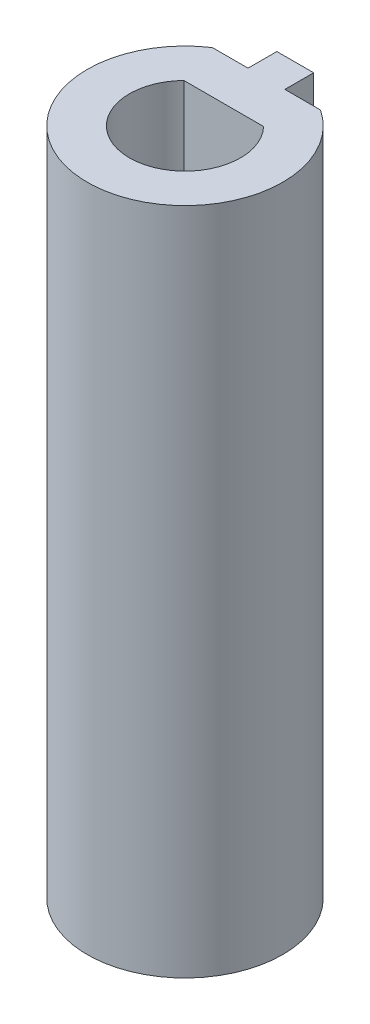
ISO-10303-21;
HEADER;
FILE_DESCRIPTION(('STEP AP214'),'2;1');
FILE_NAME('part.step','',(''),(''),'','','');
FILE_SCHEMA(('AUTOMOTIVE_DESIGN { 1 0 10303 214 1 1 1 1 }'));
ENDSEC;
DATA;
#1=APPLICATION_CONTEXT('core data for automotive mechanical design processes');
#2=APPLICATION_PROTOCOL_DEFINITION('international standard','automotive_design',2000,#1);
#3=PRODUCT_CONTEXT('',#1,'mechanical');
#4=PRODUCT('Part','Part','',(#3));
#5=PRODUCT_RELATED_PRODUCT_CATEGORY('part','',(#4));
#6=PRODUCT_DEFINITION_FORMATION('','',#4);
#7=PRODUCT_DEFINITION_CONTEXT('part definition',#1,'design');
#8=PRODUCT_DEFINITION('design','',#6,#7);
#9=PRODUCT_DEFINITION_SHAPE('','',#8);
#10=(LENGTH_UNIT() NAMED_UNIT(*) SI_UNIT(.MILLI.,.METRE.));
#11=(NAMED_UNIT(*) PLANE_ANGLE_UNIT() SI_UNIT($,.RADIAN.));
#12=(NAMED_UNIT(*) SI_UNIT($,.STERADIAN.) SOLID_ANGLE_UNIT());
#13=UNCERTAINTY_MEASURE_WITH_UNIT(LENGTH_MEASURE(1.E-05),#10,'distance_accuracy_value','');
#14=(GEOMETRIC_REPRESENTATION_CONTEXT(3) GLOBAL_UNCERTAINTY_ASSIGNED_CONTEXT((#13)) GLOBAL_UNIT_ASSIGNED_CONTEXT((#10,
#11,#12)) REPRESENTATION_CONTEXT('',''));
#15=CARTESIAN_POINT('',(0.,0.,0.));
#16=DIRECTION('',(0.,0.,1.));
#17=DIRECTION('',(1.,0.,0.));
#18=AXIS2_PLACEMENT_3D('',#15,#16,#17);
#19=CARTESIAN_POINT('',(0.,19.5,0.));
#20=DIRECTION('',(0.,-1.,0.));
#21=DIRECTION('',(0.,0.,-1.));
#22=AXIS2_PLACEMENT_3D('',#19,#20,#21);
#23=CYLINDRICAL_SURFACE('',#22,1.62);
#24=CARTESIAN_POINT('',(0.,0.,0.));
#25=DIRECTION('',(0.,1.,0.));
#26=DIRECTION('',(0.,0.,1.));
#27=AXIS2_PLACEMENT_3D('',#24,#25,#26);
#28=CIRCLE('',#27,1.62);
#29=CARTESIAN_POINT('',(-1.1623582536093,0.,-1.12841627525765));
#30=VERTEX_POINT('',#29);
#31=CARTESIAN_POINT('',(1.1623582536093,0.,-1.12841627525765));
#32=VERTEX_POINT('',#31);
#33=EDGE_CURVE('E152',#30,#32,#28,.T.);
#34=ORIENTED_EDGE('',*,*,#33,.F.);
#35=DIRECTION('',(0.,-1.,0.));
#36=VECTOR('',#35,1.);
#37=CARTESIAN_POINT('',(-1.1623582536093,19.5,-1.12841627525765));
#38=LINE('',#37,#36);
#39=CARTESIAN_POINT('',(-1.1623582536093,19.5,-1.12841627525765));
#40=VERTEX_POINT('',#39);
#41=EDGE_CURVE('E11',#40,#30,#38,.T.);
#42=ORIENTED_EDGE('',*,*,#41,.F.);
#43=CARTESIAN_POINT('',(0.,19.5,0.));
#44=DIRECTION('',(0.,1.,0.));
#45=DIRECTION('',(0.,0.,1.));
#46=AXIS2_PLACEMENT_3D('',#43,#44,#45);
#47=CIRCLE('',#46,1.62);
#48=CARTESIAN_POINT('',(1.1623582536093,19.5,-1.12841627525765));
#49=VERTEX_POINT('',#48);
#50=EDGE_CURVE('E133',#40,#49,#47,.T.);
#51=ORIENTED_EDGE('',*,*,#50,.T.);
#52=DIRECTION('',(0.,-1.,0.));
#53=VECTOR('',#52,1.);
#54=CARTESIAN_POINT('',(1.1623582536093,19.5,-1.12841627525765));
#55=LINE('',#54,#53);
#56=EDGE_CURVE('E51',#49,#32,#55,.T.);
#57=ORIENTED_EDGE('',*,*,#56,.T.);
#58=EDGE_LOOP('',(#34,#42,#51,#57));
#59=FACE_BOUND('',#58,.T.);
#60=ADVANCED_FACE('F41',(#59),#23,.F.);
#61=CARTESIAN_POINT('',(0.,19.5,-3.21507700057572));
#62=DIRECTION('',(0.,0.,-1.));
#63=DIRECTION('',(-1.,0.,0.));
#64=AXIS2_PLACEMENT_3D('',#61,#62,#63);
#65=PLANE('',#64);
#66=DIRECTION('',(1.,0.,0.));
#67=VECTOR('',#66,1.);
#68=CARTESIAN_POINT('',(0.,0.,-3.21507700057572));
#69=LINE('',#68,#67);
#70=CARTESIAN_POINT('',(-0.536355180766037,0.,-3.21507700057572));
#71=VERTEX_POINT('',#70);
#72=CARTESIAN_POINT('',(0.536355180766037,0.,-3.21507700057572));
#73=VERTEX_POINT('',#72);
#74=EDGE_CURVE('E142',#71,#73,#69,.T.);
#75=ORIENTED_EDGE('',*,*,#74,.F.);
#76=DIRECTION('',(0.,-1.,0.));
#77=VECTOR('',#76,1.);
#78=CARTESIAN_POINT('',(-0.536355180766037,19.5,-3.21507700057572));
#79=LINE('',#78,#77);
#80=CARTESIAN_POINT('',(-0.536355180766037,19.5,-3.21507700057572));
#81=VERTEX_POINT('',#80);
#82=EDGE_CURVE('E45',#81,#71,#79,.T.);
#83=ORIENTED_EDGE('',*,*,#82,.F.);
#84=DIRECTION('',(1.,0.,0.));
#85=VECTOR('',#84,1.);
#86=CARTESIAN_POINT('',(0.,19.5,-3.21507700057572));
#87=LINE('',#86,#85);
#88=CARTESIAN_POINT('',(0.536355180766037,19.5,-3.21507700057572));
#89=VERTEX_POINT('',#88);
#90=EDGE_CURVE('E124',#81,#89,#87,.T.);
#91=ORIENTED_EDGE('',*,*,#90,.T.);
#92=DIRECTION('',(0.,-1.,0.));
#93=VECTOR('',#92,1.);
#94=CARTESIAN_POINT('',(0.536355180766037,19.5,-3.21507700057572));
#95=LINE('',#94,#93);
#96=EDGE_CURVE('E114',#89,#73,#95,.T.);
#97=ORIENTED_EDGE('',*,*,#96,.T.);
#98=EDGE_LOOP('',(#75,#83,#91,#97));
#99=FACE_BOUND('',#98,.T.);
#100=ADVANCED_FACE('F43',(#99),#65,.T.);
#101=CARTESIAN_POINT('',(-0.536355180766036,19.5,0.));
#102=DIRECTION('',(1.,0.,0.));
#103=DIRECTION('',(0.,0.,-1.));
#104=AXIS2_PLACEMENT_3D('',#101,#102,#103);
#105=PLANE('',#104);
#106=DIRECTION('',(0.,0.,1.));
#107=VECTOR('',#106,1.);
#108=CARTESIAN_POINT('',(-0.536355180766036,0.,0.));
#109=LINE('',#108,#107);
#110=CARTESIAN_POINT('',(-0.536355180766037,0.,-2.375));
#111=VERTEX_POINT('',#110);
#112=EDGE_CURVE('E144',#71,#111,#109,.T.);
#113=ORIENTED_EDGE('',*,*,#112,.T.);
#114=DIRECTION('',(0.,-1.,0.));
#115=VECTOR('',#114,1.);
#116=CARTESIAN_POINT('',(-0.536355180766037,19.5,-2.375));
#117=LINE('',#116,#115);
#118=CARTESIAN_POINT('',(-0.536355180766037,19.5,-2.375));
#119=VERTEX_POINT('',#118);
#120=EDGE_CURVE('E163',#119,#111,#117,.T.);
#121=ORIENTED_EDGE('',*,*,#120,.F.);
#122=DIRECTION('',(0.,0.,1.));
#123=VECTOR('',#122,1.);
#124=CARTESIAN_POINT('',(-0.536355180766036,19.5,0.));
#125=LINE('',#124,#123);
#126=EDGE_CURVE('E126',#81,#119,#125,.T.);
#127=ORIENTED_EDGE('',*,*,#126,.F.);
#128=ORIENTED_EDGE('',*,*,#82,.T.);
#129=EDGE_LOOP('',(#113,#121,#127,#128));
#130=FACE_BOUND('',#129,.T.);
#131=ADVANCED_FACE('F171',(#130),#105,.F.);
#132=CARTESIAN_POINT('',(0.,19.5,-2.375));
#133=DIRECTION('',(0.,0.,1.));
#134=DIRECTION('',(1.,0.,0.));
#135=AXIS2_PLACEMENT_3D('',#132,#133,#134);
#136=PLANE('',#135);
#137=DIRECTION('',(-1.,0.,0.));
#138=VECTOR('',#137,1.);
#139=CARTESIAN_POINT('',(0.,0.,-2.375));
#140=LINE('',#139,#138);
#141=CARTESIAN_POINT('',(-1.57539677541881,0.,-2.375));
#142=VERTEX_POINT('',#141);
#143=EDGE_CURVE('E146',#111,#142,#140,.T.);
#144=ORIENTED_EDGE('',*,*,#143,.T.);
#145=DIRECTION('',(0.,-1.,0.));
#146=VECTOR('',#145,1.);
#147=CARTESIAN_POINT('',(-1.57539677541881,19.5,-2.375));
#148=LINE('',#147,#146);
#149=CARTESIAN_POINT('',(-1.57539677541881,19.5,-2.375));
#150=VERTEX_POINT('',#149);
#151=EDGE_CURVE('E161',#150,#142,#148,.T.);
#152=ORIENTED_EDGE('',*,*,#151,.F.);
#153=DIRECTION('',(-1.,0.,0.));
#154=VECTOR('',#153,1.);
#155=CARTESIAN_POINT('',(0.,19.5,-2.375));
#156=LINE('',#155,#154);
#157=EDGE_CURVE('E138',#119,#150,#156,.T.);
#158=ORIENTED_EDGE('',*,*,#157,.F.);
#159=ORIENTED_EDGE('',*,*,#120,.T.);
#160=EDGE_LOOP('',(#144,#152,#158,#159));
#161=FACE_BOUND('',#160,.T.);
#162=ADVANCED_FACE('F178',(#161),#136,.F.);
#163=CARTESIAN_POINT('',(0.,19.5,0.));
#164=DIRECTION('',(0.,-1.,0.));
#165=DIRECTION('',(0.,0.,-1.));
#166=AXIS2_PLACEMENT_3D('',#163,#164,#165);
#167=CYLINDRICAL_SURFACE('',#166,2.85);
#168=CARTESIAN_POINT('',(0.,0.,0.));
#169=DIRECTION('',(0.,1.,0.));
#170=DIRECTION('',(0.,0.,1.));
#171=AXIS2_PLACEMENT_3D('',#168,#169,#170);
#172=CIRCLE('',#171,2.85);
#173=CARTESIAN_POINT('',(1.57539677541881,0.,-2.375));
#174=VERTEX_POINT('',#173);
#175=EDGE_CURVE('E148',#142,#174,#172,.T.);
#176=ORIENTED_EDGE('',*,*,#175,.T.);
#177=DIRECTION('',(0.,-1.,0.));
#178=VECTOR('',#177,1.);
#179=CARTESIAN_POINT('',(1.57539677541881,19.5,-2.375));
#180=LINE('',#179,#178);
#181=CARTESIAN_POINT('',(1.57539677541881,19.5,-2.375));
#182=VERTEX_POINT('',#181);
#183=EDGE_CURVE('E158',#182,#174,#180,.T.);
#184=ORIENTED_EDGE('',*,*,#183,.F.);
#185=CARTESIAN_POINT('',(0.,19.5,0.));
#186=DIRECTION('',(0.,1.,0.));
#187=DIRECTION('',(0.,0.,1.));
#188=AXIS2_PLACEMENT_3D('',#185,#186,#187);
#189=CIRCLE('',#188,2.85);
#190=EDGE_CURVE('E136',#150,#182,#189,.T.);
#191=ORIENTED_EDGE('',*,*,#190,.F.);
#192=ORIENTED_EDGE('',*,*,#151,.T.);
#193=EDGE_LOOP('',(#176,#184,#191,#192));
#194=FACE_BOUND('',#193,.T.);
#195=ADVANCED_FACE('F181',(#194),#167,.T.);
#196=CARTESIAN_POINT('',(0.536355180766037,0.,-2.375));
#197=VERTEX_POINT('',#196);
#198=EDGE_CURVE('E149',#174,#197,#140,.T.);
#199=ORIENTED_EDGE('',*,*,#198,.T.);
#200=DIRECTION('',(0.,-1.,0.));
#201=VECTOR('',#200,1.);
#202=CARTESIAN_POINT('',(0.536355180766037,19.5,-2.375));
#203=LINE('',#202,#201);
#204=CARTESIAN_POINT('',(0.536355180766037,19.5,-2.375));
#205=VERTEX_POINT('',#204);
#206=EDGE_CURVE('E121',#205,#197,#203,.T.);
#207=ORIENTED_EDGE('',*,*,#206,.F.);
#208=EDGE_CURVE('E131',#182,#205,#156,.T.);
#209=ORIENTED_EDGE('',*,*,#208,.F.);
#210=ORIENTED_EDGE('',*,*,#183,.T.);
#211=EDGE_LOOP('',(#199,#207,#209,#210));
#212=FACE_BOUND('',#211,.T.);
#213=ADVANCED_FACE('F186',(#212),#136,.F.);
#214=CARTESIAN_POINT('',(0.536355180766037,19.5,0.));
#215=DIRECTION('',(1.,0.,0.));
#216=DIRECTION('',(0.,0.,-1.));
#217=AXIS2_PLACEMENT_3D('',#214,#215,#216);
#218=PLANE('',#217);
#219=DIRECTION('',(0.,0.,1.));
#220=VECTOR('',#219,1.);
#221=CARTESIAN_POINT('',(0.536355180766037,0.,0.));
#222=LINE('',#221,#220);
#223=EDGE_CURVE('E119',#73,#197,#222,.T.);
#224=ORIENTED_EDGE('',*,*,#223,.F.);
#225=ORIENTED_EDGE('',*,*,#96,.F.);
#226=DIRECTION('',(0.,0.,1.));
#227=VECTOR('',#226,1.);
#228=CARTESIAN_POINT('',(0.536355180766037,19.5,0.));
#229=LINE('',#228,#227);
#230=EDGE_CURVE('E117',#89,#205,#229,.T.);
#231=ORIENTED_EDGE('',*,*,#230,.T.);
#232=ORIENTED_EDGE('',*,*,#206,.T.);
#233=EDGE_LOOP('',(#224,#225,#231,#232));
#234=FACE_BOUND('',#233,.T.);
#235=ADVANCED_FACE('F115',(#234),#218,.T.);
#236=CARTESIAN_POINT('',(0.,19.5,-1.12841627525765));
#237=DIRECTION('',(0.,0.,-1.));
#238=DIRECTION('',(-1.,0.,0.));
#239=AXIS2_PLACEMENT_3D('',#236,#237,#238);
#240=PLANE('',#239);
#241=DIRECTION('',(1.,0.,0.));
#242=VECTOR('',#241,1.);
#243=CARTESIAN_POINT('',(0.,0.,-1.12841627525765));
#244=LINE('',#243,#242);
#245=EDGE_CURVE('E127',#30,#32,#244,.T.);
#246=ORIENTED_EDGE('',*,*,#245,.T.);
#247=ORIENTED_EDGE('',*,*,#56,.F.);
#248=DIRECTION('',(1.,0.,0.));
#249=VECTOR('',#248,1.);
#250=CARTESIAN_POINT('',(0.,19.5,-1.12841627525765));
#251=LINE('',#250,#249);
#252=EDGE_CURVE('E59',#40,#49,#251,.T.);
#253=ORIENTED_EDGE('',*,*,#252,.F.);
#254=ORIENTED_EDGE('',*,*,#41,.T.);
#255=EDGE_LOOP('',(#246,#247,#253,#254));
#256=FACE_BOUND('',#255,.T.);
#257=ADVANCED_FACE('F193',(#256),#240,.F.);
#258=CARTESIAN_POINT('',(0.,19.5,0.));
#259=DIRECTION('',(0.,1.,0.));
#260=DIRECTION('',(0.,0.,1.));
#261=AXIS2_PLACEMENT_3D('',#258,#259,#260);
#262=PLANE('',#261);
#263=ORIENTED_EDGE('',*,*,#90,.F.);
#264=ORIENTED_EDGE('',*,*,#126,.T.);
#265=ORIENTED_EDGE('',*,*,#157,.T.);
#266=ORIENTED_EDGE('',*,*,#190,.T.);
#267=ORIENTED_EDGE('',*,*,#208,.T.);
#268=ORIENTED_EDGE('',*,*,#230,.F.);
#269=EDGE_LOOP('',(#263,#264,#265,#266,#267,#268));
#270=FACE_BOUND('',#269,.T.);
#271=ORIENTED_EDGE('',*,*,#50,.F.);
#272=ORIENTED_EDGE('',*,*,#252,.T.);
#273=EDGE_LOOP('',(#271,#272));
#274=FACE_BOUND('',#273,.T.);
#275=ADVANCED_FACE('F129',(#270,#274),#262,.T.);
#276=CARTESIAN_POINT('',(0.,0.,0.));
#277=DIRECTION('',(0.,1.,0.));
#278=DIRECTION('',(0.,0.,1.));
#279=AXIS2_PLACEMENT_3D('',#276,#277,#278);
#280=PLANE('',#279);
#281=ORIENTED_EDGE('',*,*,#74,.T.);
#282=ORIENTED_EDGE('',*,*,#223,.T.);
#283=ORIENTED_EDGE('',*,*,#198,.F.);
#284=ORIENTED_EDGE('',*,*,#175,.F.);
#285=ORIENTED_EDGE('',*,*,#143,.F.);
#286=ORIENTED_EDGE('',*,*,#112,.F.);
#287=EDGE_LOOP('',(#281,#282,#283,#284,#285,#286));
#288=FACE_BOUND('',#287,.T.);
#289=ORIENTED_EDGE('',*,*,#33,.T.);
#290=ORIENTED_EDGE('',*,*,#245,.F.);
#291=EDGE_LOOP('',(#289,#290));
#292=FACE_BOUND('',#291,.T.);
#293=ADVANCED_FACE('F173',(#288,#292),#280,.F.);
#294=CLOSED_SHELL('',(#60,#100,#131,#162,#195,#213,#235,#257,#275,#293));
#295=MANIFOLD_SOLID_BREP('B2',#294);
#296=ADVANCED_BREP_SHAPE_REPRESENTATION('',(#18,#295),#14);
#297=SHAPE_DEFINITION_REPRESENTATION(#9,#296);
ENDSEC;
END-ISO-10303-21;
